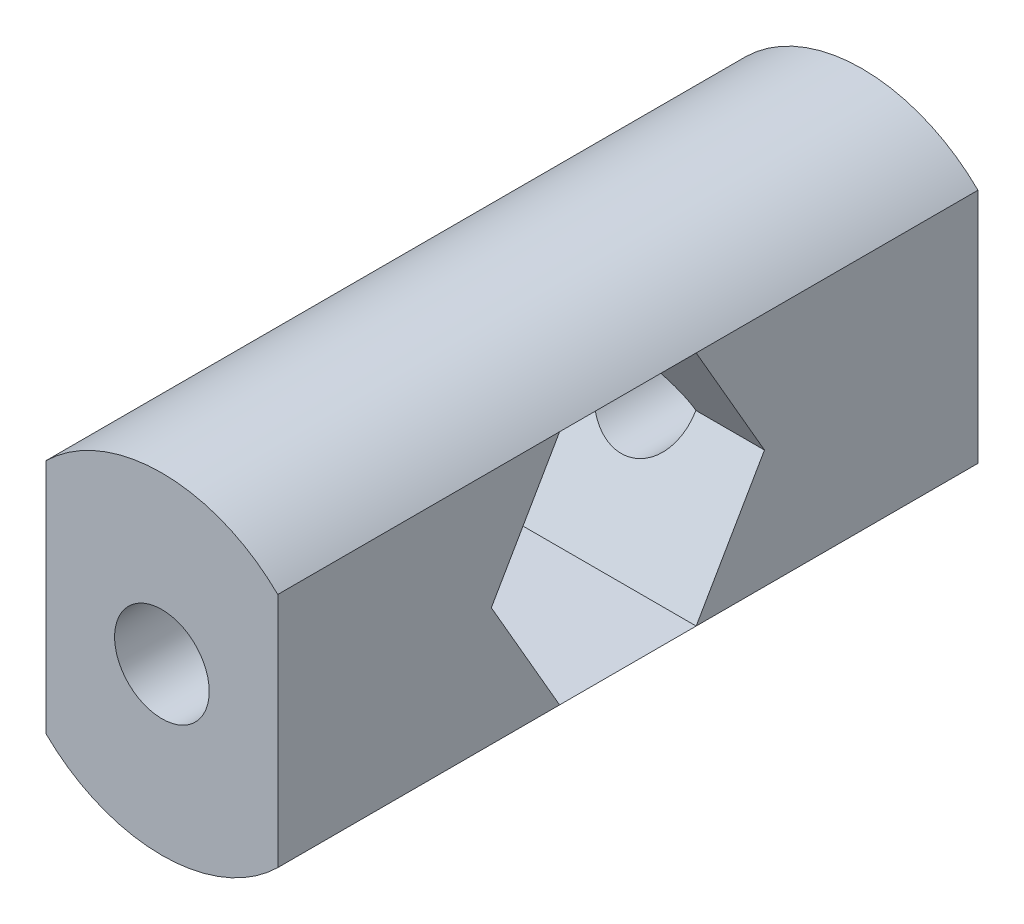
ISO-10303-21;
HEADER;
FILE_DESCRIPTION(('STEP AP214'),'2;1');
FILE_NAME('part.step','',(''),(''),'','','');
FILE_SCHEMA(('AUTOMOTIVE_DESIGN { 1 0 10303 214 1 1 1 1 }'));
ENDSEC;
DATA;
#1=APPLICATION_CONTEXT('core data for automotive mechanical design processes');
#2=APPLICATION_PROTOCOL_DEFINITION('international standard','automotive_design',2000,#1);
#3=PRODUCT_CONTEXT('',#1,'mechanical');
#4=PRODUCT('Part','Part','',(#3));
#5=PRODUCT_RELATED_PRODUCT_CATEGORY('part','',(#4));
#6=PRODUCT_DEFINITION_FORMATION('','',#4);
#7=PRODUCT_DEFINITION_CONTEXT('part definition',#1,'design');
#8=PRODUCT_DEFINITION('design','',#6,#7);
#9=PRODUCT_DEFINITION_SHAPE('','',#8);
#10=(LENGTH_UNIT() NAMED_UNIT(*) SI_UNIT(.MILLI.,.METRE.));
#11=(NAMED_UNIT(*) PLANE_ANGLE_UNIT() SI_UNIT($,.RADIAN.));
#12=(NAMED_UNIT(*) SI_UNIT($,.STERADIAN.) SOLID_ANGLE_UNIT());
#13=UNCERTAINTY_MEASURE_WITH_UNIT(LENGTH_MEASURE(1.E-05),#10,'distance_accuracy_value','');
#14=(GEOMETRIC_REPRESENTATION_CONTEXT(3) GLOBAL_UNCERTAINTY_ASSIGNED_CONTEXT((#13)) GLOBAL_UNIT_ASSIGNED_CONTEXT((#10,
#11,#12)) REPRESENTATION_CONTEXT('',''));
#15=CARTESIAN_POINT('',(0.,0.,0.));
#16=DIRECTION('',(0.,0.,1.));
#17=DIRECTION('',(1.,0.,0.));
#18=AXIS2_PLACEMENT_3D('',#15,#16,#17);
#19=CARTESIAN_POINT('',(12.2474487139159,12.5,-37.));
#20=DIRECTION('',(-1.,0.,0.));
#21=DIRECTION('',(0.,0.,1.));
#22=AXIS2_PLACEMENT_3D('',#19,#20,#21);
#23=PLANE('',#22);
#24=DIRECTION('',(0.,0.,1.));
#25=VECTOR('',#24,1.);
#26=CARTESIAN_POINT('',(12.2474487139159,-12.5,-37.));
#27=LINE('',#26,#25);
#28=CARTESIAN_POINT('',(12.2474487139159,-12.5,7.21687836487032));
#29=VERTEX_POINT('',#28);
#30=CARTESIAN_POINT('',(12.2474487139159,-12.5,37.));
#31=VERTEX_POINT('',#30);
#32=EDGE_CURVE('E165',#29,#31,#27,.T.);
#33=ORIENTED_EDGE('',*,*,#32,.F.);
#34=DIRECTION('',(0.,-0.866025403784439,-0.5));
#35=VECTOR('',#34,1.);
#36=CARTESIAN_POINT('',(12.2474487139159,0.,14.4337567297406));
#37=LINE('',#36,#35);
#38=CARTESIAN_POINT('',(12.2474487139159,0.,14.4337567297406));
#39=VERTEX_POINT('',#38);
#40=EDGE_CURVE('E253',#39,#29,#37,.T.);
#41=ORIENTED_EDGE('',*,*,#40,.F.);
#42=DIRECTION('',(0.,-0.866025403784439,0.5));
#43=VECTOR('',#42,1.);
#44=CARTESIAN_POINT('',(12.2474487139159,12.5,7.21687836487032));
#45=LINE('',#44,#43);
#46=CARTESIAN_POINT('',(12.2474487139159,12.5,7.21687836487032));
#47=VERTEX_POINT('',#46);
#48=EDGE_CURVE('E148',#47,#39,#45,.T.);
#49=ORIENTED_EDGE('',*,*,#48,.F.);
#50=DIRECTION('',(0.,0.,1.));
#51=VECTOR('',#50,1.);
#52=CARTESIAN_POINT('',(12.2474487139159,12.5,-37.));
#53=LINE('',#52,#51);
#54=CARTESIAN_POINT('',(12.2474487139159,12.5,37.));
#55=VERTEX_POINT('',#54);
#56=EDGE_CURVE('E147',#47,#55,#53,.T.);
#57=ORIENTED_EDGE('',*,*,#56,.T.);
#58=DIRECTION('',(0.,-1.,0.));
#59=VECTOR('',#58,1.);
#60=CARTESIAN_POINT('',(12.2474487139159,12.5,37.));
#61=LINE('',#60,#59);
#62=EDGE_CURVE('E161',#55,#31,#61,.T.);
#63=ORIENTED_EDGE('',*,*,#62,.T.);
#64=EDGE_LOOP('',(#33,#41,#49,#57,#63));
#65=FACE_BOUND('',#64,.T.);
#66=ADVANCED_FACE('F33',(#65),#23,.F.);
#67=CARTESIAN_POINT('',(-12.2474487139159,12.5,-37.));
#68=DIRECTION('',(1.,0.,0.));
#69=DIRECTION('',(0.,0.,-1.));
#70=AXIS2_PLACEMENT_3D('',#67,#68,#69);
#71=PLANE('',#70);
#72=DIRECTION('',(0.,-0.866025403784439,0.5));
#73=VECTOR('',#72,1.);
#74=CARTESIAN_POINT('',(-12.2474487139159,31.6464699700121,-3.83734122634725));
#75=LINE('',#74,#73);
#76=CARTESIAN_POINT('',(-12.2474487139159,12.5,7.21687836487032));
#77=VERTEX_POINT('',#76);
#78=CARTESIAN_POINT('',(-12.2474487139159,0.,14.4337567297406));
#79=VERTEX_POINT('',#78);
#80=EDGE_CURVE('E204',#77,#79,#75,.T.);
#81=ORIENTED_EDGE('',*,*,#80,.T.);
#82=DIRECTION('',(0.,-0.866025403784439,-0.5));
#83=VECTOR('',#82,1.);
#84=CARTESIAN_POINT('',(-12.2474487139159,-12.8964699700121,6.98797632095823));
#85=LINE('',#84,#83);
#86=CARTESIAN_POINT('',(-12.2474487139159,-12.5,7.21687836487032));
#87=VERTEX_POINT('',#86);
#88=EDGE_CURVE('E192',#79,#87,#85,.T.);
#89=ORIENTED_EDGE('',*,*,#88,.T.);
#90=DIRECTION('',(0.,0.,1.));
#91=VECTOR('',#90,1.);
#92=CARTESIAN_POINT('',(-12.2474487139159,-12.5,-37.));
#93=LINE('',#92,#91);
#94=CARTESIAN_POINT('',(-12.2474487139159,-12.5,37.));
#95=VERTEX_POINT('',#94);
#96=EDGE_CURVE('E227',#87,#95,#93,.T.);
#97=ORIENTED_EDGE('',*,*,#96,.T.);
#98=DIRECTION('',(0.,1.,0.));
#99=VECTOR('',#98,1.);
#100=CARTESIAN_POINT('',(-12.2474487139159,12.5,37.));
#101=LINE('',#100,#99);
#102=CARTESIAN_POINT('',(-12.2474487139159,12.5,37.));
#103=VERTEX_POINT('',#102);
#104=EDGE_CURVE('E214',#95,#103,#101,.T.);
#105=ORIENTED_EDGE('',*,*,#104,.T.);
#106=DIRECTION('',(0.,0.,1.));
#107=VECTOR('',#106,1.);
#108=CARTESIAN_POINT('',(-12.2474487139159,12.5,-37.));
#109=LINE('',#108,#107);
#110=EDGE_CURVE('E220',#77,#103,#109,.T.);
#111=ORIENTED_EDGE('',*,*,#110,.F.);
#112=EDGE_LOOP('',(#81,#89,#97,#105,#111));
#113=FACE_BOUND('',#112,.T.);
#114=ADVANCED_FACE('F245',(#113),#71,.F.);
#115=CARTESIAN_POINT('',(0.,0.,-37.));
#116=DIRECTION('',(0.,0.,1.));
#117=DIRECTION('',(1.,0.,0.));
#118=AXIS2_PLACEMENT_3D('',#115,#116,#117);
#119=CYLINDRICAL_SURFACE('',#118,5.);
#120=CARTESIAN_POINT('',(0.,0.,14.4337567297406));
#121=DIRECTION('',(0.,0.5,0.866025403784439));
#122=DIRECTION('',(0.,-0.866025403784439,0.5));
#123=AXIS2_PLACEMENT_3D('',#120,#121,#122);
#124=ELLIPSE('',#123,5.77350269189626,5.);
#125=CARTESIAN_POINT('',(-4.99999999999998,0.,14.4337567297406));
#126=VERTEX_POINT('',#125);
#127=CARTESIAN_POINT('',(5.00000000000002,0.,14.4337567297406));
#128=VERTEX_POINT('',#127);
#129=EDGE_CURVE('E41',#126,#128,#124,.F.);
#130=ORIENTED_EDGE('',*,*,#129,.T.);
#131=CARTESIAN_POINT('',(0.,0.,14.4337567297406));
#132=DIRECTION('',(0.,-0.5,0.866025403784439));
#133=DIRECTION('',(0.,0.866025403784439,0.5));
#134=AXIS2_PLACEMENT_3D('',#131,#132,#133);
#135=ELLIPSE('',#134,5.77350269189626,5.);
#136=EDGE_CURVE('E11',#128,#126,#135,.F.);
#137=ORIENTED_EDGE('',*,*,#136,.T.);
#138=EDGE_LOOP('',(#130,#137));
#139=FACE_BOUND('',#138,.T.);
#140=CARTESIAN_POINT('',(0.,0.,37.));
#141=DIRECTION('',(0.,0.,1.));
#142=DIRECTION('',(1.,0.,0.));
#143=AXIS2_PLACEMENT_3D('',#140,#141,#142);
#144=CIRCLE('',#143,5.);
#145=CARTESIAN_POINT('',(5.,0.,37.));
#146=VERTEX_POINT('',#145);
#147=EDGE_CURVE('E210',#146,#146,#144,.T.);
#148=ORIENTED_EDGE('',*,*,#147,.T.);
#149=EDGE_LOOP('',(#148));
#150=FACE_BOUND('',#149,.T.);
#151=ADVANCED_FACE('F177',(#139,#150),#119,.F.);
#152=CARTESIAN_POINT('',(0.,0.,37.));
#153=DIRECTION('',(0.,0.,-1.));
#154=DIRECTION('',(-1.,0.,0.));
#155=AXIS2_PLACEMENT_3D('',#152,#153,#154);
#156=CYLINDRICAL_SURFACE('',#155,17.5);
#157=CARTESIAN_POINT('',(0.,0.,37.));
#158=DIRECTION('',(0.,0.,1.));
#159=DIRECTION('',(1.,0.,0.));
#160=AXIS2_PLACEMENT_3D('',#157,#158,#159);
#161=CIRCLE('',#160,17.5);
#162=EDGE_CURVE('E169',#95,#31,#161,.T.);
#163=ORIENTED_EDGE('',*,*,#162,.F.);
#164=ORIENTED_EDGE('',*,*,#96,.F.);
#165=CARTESIAN_POINT('',(-12.2474487139159,-12.5,-7.21687836487032));
#166=VERTEX_POINT('',#165);
#167=EDGE_CURVE('E226',#166,#87,#93,.T.);
#168=ORIENTED_EDGE('',*,*,#167,.F.);
#169=CARTESIAN_POINT('',(-12.2474487139159,-12.5,-37.));
#170=VERTEX_POINT('',#169);
#171=EDGE_CURVE('E223',#170,#166,#93,.T.);
#172=ORIENTED_EDGE('',*,*,#171,.F.);
#173=CARTESIAN_POINT('',(0.,0.,-37.));
#174=DIRECTION('',(0.,0.,1.));
#175=DIRECTION('',(1.,0.,0.));
#176=AXIS2_PLACEMENT_3D('',#173,#174,#175);
#177=CIRCLE('',#176,17.5);
#178=CARTESIAN_POINT('',(12.2474487139159,-12.5,-37.));
#179=VERTEX_POINT('',#178);
#180=EDGE_CURVE('E154',#170,#179,#177,.T.);
#181=ORIENTED_EDGE('',*,*,#180,.T.);
#182=CARTESIAN_POINT('',(12.2474487139159,-12.5,-7.21687836487032));
#183=VERTEX_POINT('',#182);
#184=EDGE_CURVE('E158',#179,#183,#27,.T.);
#185=ORIENTED_EDGE('',*,*,#184,.T.);
#186=DIRECTION('',(0.,0.,-1.));
#187=VECTOR('',#186,1.);
#188=CARTESIAN_POINT('',(12.2474487139159,-12.5,7.21687836487032));
#189=LINE('',#188,#187);
#190=EDGE_CURVE('E201',#29,#183,#189,.T.);
#191=ORIENTED_EDGE('',*,*,#190,.F.);
#192=ORIENTED_EDGE('',*,*,#32,.T.);
#193=EDGE_LOOP('',(#163,#164,#168,#172,#181,#185,#191,#192));
#194=FACE_BOUND('',#193,.T.);
#195=ADVANCED_FACE('F248',(#194),#156,.T.);
#196=CARTESIAN_POINT('',(12.2474487139159,12.5,-37.));
#197=VERTEX_POINT('',#196);
#198=CARTESIAN_POINT('',(-12.2474487139159,12.5,-37.));
#199=VERTEX_POINT('',#198);
#200=EDGE_CURVE('E156',#197,#199,#177,.T.);
#201=ORIENTED_EDGE('',*,*,#200,.T.);
#202=CARTESIAN_POINT('',(-12.2474487139159,12.5,-7.21687836487033));
#203=VERTEX_POINT('',#202);
#204=EDGE_CURVE('E228',#199,#203,#109,.T.);
#205=ORIENTED_EDGE('',*,*,#204,.T.);
#206=EDGE_CURVE('E128',#203,#77,#109,.T.);
#207=ORIENTED_EDGE('',*,*,#206,.T.);
#208=ORIENTED_EDGE('',*,*,#110,.T.);
#209=EDGE_CURVE('E166',#55,#103,#161,.T.);
#210=ORIENTED_EDGE('',*,*,#209,.F.);
#211=ORIENTED_EDGE('',*,*,#56,.F.);
#212=DIRECTION('',(0.,0.,1.));
#213=VECTOR('',#212,1.);
#214=CARTESIAN_POINT('',(12.2474487139159,12.5,-7.21687836487032));
#215=LINE('',#214,#213);
#216=CARTESIAN_POINT('',(12.2474487139159,12.5,-7.21687836487032));
#217=VERTEX_POINT('',#216);
#218=EDGE_CURVE('E125',#217,#47,#215,.T.);
#219=ORIENTED_EDGE('',*,*,#218,.F.);
#220=EDGE_CURVE('E144',#197,#217,#53,.T.);
#221=ORIENTED_EDGE('',*,*,#220,.F.);
#222=EDGE_LOOP('',(#201,#205,#207,#208,#210,#211,#219,#221));
#223=FACE_BOUND('',#222,.T.);
#224=ADVANCED_FACE('F35',(#223),#156,.T.);
#225=CARTESIAN_POINT('',(0.,0.,37.));
#226=DIRECTION('',(0.,0.,1.));
#227=DIRECTION('',(1.,0.,0.));
#228=AXIS2_PLACEMENT_3D('',#225,#226,#227);
#229=PLANE('',#228);
#230=ORIENTED_EDGE('',*,*,#147,.F.);
#231=EDGE_LOOP('',(#230));
#232=FACE_BOUND('',#231,.T.);
#233=ORIENTED_EDGE('',*,*,#104,.F.);
#234=ORIENTED_EDGE('',*,*,#162,.T.);
#235=ORIENTED_EDGE('',*,*,#62,.F.);
#236=ORIENTED_EDGE('',*,*,#209,.T.);
#237=EDGE_LOOP('',(#233,#234,#235,#236));
#238=FACE_BOUND('',#237,.T.);
#239=ADVANCED_FACE('F241',(#232,#238),#229,.T.);
#240=CARTESIAN_POINT('',(0.,0.,-37.));
#241=DIRECTION('',(0.,0.,1.));
#242=DIRECTION('',(1.,0.,0.));
#243=AXIS2_PLACEMENT_3D('',#240,#241,#242);
#244=PLANE('',#243);
#245=CARTESIAN_POINT('',(0.,0.,-37.));
#246=DIRECTION('',(0.,0.,1.));
#247=DIRECTION('',(1.,0.,0.));
#248=AXIS2_PLACEMENT_3D('',#245,#246,#247);
#249=CIRCLE('',#248,5.);
#250=CARTESIAN_POINT('',(5.,0.,-37.));
#251=VERTEX_POINT('',#250);
#252=EDGE_CURVE('E211',#251,#251,#249,.T.);
#253=ORIENTED_EDGE('',*,*,#252,.T.);
#254=EDGE_LOOP('',(#253));
#255=FACE_BOUND('',#254,.T.);
#256=ORIENTED_EDGE('',*,*,#180,.F.);
#257=DIRECTION('',(0.,1.,0.));
#258=VECTOR('',#257,1.);
#259=CARTESIAN_POINT('',(-12.2474487139159,12.5,-37.));
#260=LINE('',#259,#258);
#261=EDGE_CURVE('E217',#170,#199,#260,.T.);
#262=ORIENTED_EDGE('',*,*,#261,.T.);
#263=ORIENTED_EDGE('',*,*,#200,.F.);
#264=DIRECTION('',(0.,-1.,0.));
#265=VECTOR('',#264,1.);
#266=CARTESIAN_POINT('',(12.2474487139159,12.5,-37.));
#267=LINE('',#266,#265);
#268=EDGE_CURVE('E153',#197,#179,#267,.T.);
#269=ORIENTED_EDGE('',*,*,#268,.T.);
#270=EDGE_LOOP('',(#256,#262,#263,#269));
#271=FACE_BOUND('',#270,.T.);
#272=ADVANCED_FACE('F264',(#255,#271),#244,.F.);
#273=DIRECTION('',(0.,0.866025403784438,0.5));
#274=VECTOR('',#273,1.);
#275=CARTESIAN_POINT('',(12.2474487139159,0.,-14.4337567297406));
#276=LINE('',#275,#274);
#277=CARTESIAN_POINT('',(12.2474487139159,0.,-14.4337567297406));
#278=VERTEX_POINT('',#277);
#279=EDGE_CURVE('E134',#278,#217,#276,.T.);
#280=ORIENTED_EDGE('',*,*,#279,.F.);
#281=DIRECTION('',(0.,0.866025403784439,-0.5));
#282=VECTOR('',#281,1.);
#283=CARTESIAN_POINT('',(12.2474487139159,-12.5,-7.21687836487032));
#284=LINE('',#283,#282);
#285=EDGE_CURVE('E48',#183,#278,#284,.T.);
#286=ORIENTED_EDGE('',*,*,#285,.F.);
#287=ORIENTED_EDGE('',*,*,#184,.F.);
#288=ORIENTED_EDGE('',*,*,#268,.F.);
#289=ORIENTED_EDGE('',*,*,#220,.T.);
#290=EDGE_LOOP('',(#280,#286,#287,#288,#289));
#291=FACE_BOUND('',#290,.T.);
#292=ADVANCED_FACE('F150',(#291),#23,.F.);
#293=ORIENTED_EDGE('',*,*,#171,.T.);
#294=DIRECTION('',(0.,0.866025403784439,-0.5));
#295=VECTOR('',#294,1.);
#296=CARTESIAN_POINT('',(-12.2474487139159,19.1464699700121,-25.4879763209582));
#297=LINE('',#296,#295);
#298=CARTESIAN_POINT('',(-12.2474487139159,0.,-14.4337567297406));
#299=VERTEX_POINT('',#298);
#300=EDGE_CURVE('E207',#166,#299,#297,.T.);
#301=ORIENTED_EDGE('',*,*,#300,.T.);
#302=DIRECTION('',(0.,0.866025403784439,0.5));
#303=VECTOR('',#302,1.);
#304=CARTESIAN_POINT('',(-12.2474487139159,-0.396469970012121,-14.6626587736527));
#305=LINE('',#304,#303);
#306=EDGE_CURVE('E202',#299,#203,#305,.T.);
#307=ORIENTED_EDGE('',*,*,#306,.T.);
#308=ORIENTED_EDGE('',*,*,#204,.F.);
#309=ORIENTED_EDGE('',*,*,#261,.F.);
#310=EDGE_LOOP('',(#293,#301,#307,#308,#309));
#311=FACE_BOUND('',#310,.T.);
#312=ADVANCED_FACE('F263',(#311),#71,.F.);
#313=CARTESIAN_POINT('',(0.,0.,-14.4337567297406));
#314=DIRECTION('',(0.,0.5,-0.866025403784438));
#315=DIRECTION('',(0.,0.866025403784439,0.5));
#316=AXIS2_PLACEMENT_3D('',#313,#314,#315);
#317=ELLIPSE('',#316,5.77350269189626,5.);
#318=CARTESIAN_POINT('',(4.99999999999998,0.,-14.4337567297406));
#319=VERTEX_POINT('',#318);
#320=CARTESIAN_POINT('',(-5.00000000000002,0.,-14.4337567297406));
#321=VERTEX_POINT('',#320);
#322=EDGE_CURVE('E168',#319,#321,#317,.F.);
#323=ORIENTED_EDGE('',*,*,#322,.T.);
#324=CARTESIAN_POINT('',(0.,0.,-14.4337567297406));
#325=DIRECTION('',(0.,-0.5,-0.866025403784439));
#326=DIRECTION('',(0.,-0.866025403784439,0.5));
#327=AXIS2_PLACEMENT_3D('',#324,#325,#326);
#328=ELLIPSE('',#327,5.77350269189626,5.);
#329=EDGE_CURVE('E173',#321,#319,#328,.F.);
#330=ORIENTED_EDGE('',*,*,#329,.T.);
#331=EDGE_LOOP('',(#323,#330));
#332=FACE_BOUND('',#331,.T.);
#333=ORIENTED_EDGE('',*,*,#252,.F.);
#334=EDGE_LOOP('',(#333));
#335=FACE_BOUND('',#334,.T.);
#336=ADVANCED_FACE('F282',(#332,#335),#119,.F.);
#337=CARTESIAN_POINT('',(-61.7525512860841,-12.5,7.21687836487032));
#338=DIRECTION('',(0.,-1.,0.));
#339=DIRECTION('',(0.,0.,-1.));
#340=AXIS2_PLACEMENT_3D('',#337,#338,#339);
#341=PLANE('',#340);
#342=DIRECTION('',(1.,0.,0.));
#343=VECTOR('',#342,1.);
#344=CARTESIAN_POINT('',(-61.7525512860841,-12.5,7.21687836487032));
#345=LINE('',#344,#343);
#346=EDGE_CURVE('E193',#87,#29,#345,.T.);
#347=ORIENTED_EDGE('',*,*,#346,.T.);
#348=ORIENTED_EDGE('',*,*,#190,.T.);
#349=DIRECTION('',(1.,0.,0.));
#350=VECTOR('',#349,1.);
#351=CARTESIAN_POINT('',(-61.7525512860841,-12.5,-7.21687836487032));
#352=LINE('',#351,#350);
#353=EDGE_CURVE('E195',#166,#183,#352,.T.);
#354=ORIENTED_EDGE('',*,*,#353,.F.);
#355=ORIENTED_EDGE('',*,*,#167,.T.);
#356=EDGE_LOOP('',(#347,#348,#354,#355));
#357=FACE_BOUND('',#356,.T.);
#358=ADVANCED_FACE('F260',(#357),#341,.F.);
#359=CARTESIAN_POINT('',(-61.7525512860841,12.5,-7.21687836487032));
#360=DIRECTION('',(0.,1.,0.));
#361=DIRECTION('',(0.,0.,1.));
#362=AXIS2_PLACEMENT_3D('',#359,#360,#361);
#363=PLANE('',#362);
#364=DIRECTION('',(1.,0.,0.));
#365=VECTOR('',#364,1.);
#366=CARTESIAN_POINT('',(-61.7525512860841,12.5,-7.21687836487032));
#367=LINE('',#366,#365);
#368=EDGE_CURVE('E56',#203,#217,#367,.T.);
#369=ORIENTED_EDGE('',*,*,#368,.T.);
#370=ORIENTED_EDGE('',*,*,#218,.T.);
#371=DIRECTION('',(1.,0.,0.));
#372=VECTOR('',#371,1.);
#373=CARTESIAN_POINT('',(-61.7525512860841,12.5,7.21687836487032));
#374=LINE('',#373,#372);
#375=EDGE_CURVE('E130',#77,#47,#374,.T.);
#376=ORIENTED_EDGE('',*,*,#375,.F.);
#377=ORIENTED_EDGE('',*,*,#206,.F.);
#378=EDGE_LOOP('',(#369,#370,#376,#377));
#379=FACE_BOUND('',#378,.T.);
#380=ADVANCED_FACE('F122',(#379),#363,.F.);
#381=CARTESIAN_POINT('',(-61.7525512860841,-12.5,-7.21687836487032));
#382=DIRECTION('',(0.,-0.5,-0.866025403784439));
#383=DIRECTION('',(0.,0.866025403784439,-0.5));
#384=AXIS2_PLACEMENT_3D('',#381,#382,#383);
#385=PLANE('',#384);
#386=ORIENTED_EDGE('',*,*,#353,.T.);
#387=ORIENTED_EDGE('',*,*,#285,.T.);
#388=DIRECTION('',(1.,0.,0.));
#389=VECTOR('',#388,1.);
#390=CARTESIAN_POINT('',(-61.7525512860841,0.,-14.4337567297406));
#391=LINE('',#390,#389);
#392=EDGE_CURVE('E136',#319,#278,#391,.T.);
#393=ORIENTED_EDGE('',*,*,#392,.F.);
#394=ORIENTED_EDGE('',*,*,#329,.F.);
#395=EDGE_CURVE('E131',#299,#321,#391,.T.);
#396=ORIENTED_EDGE('',*,*,#395,.F.);
#397=ORIENTED_EDGE('',*,*,#300,.F.);
#398=EDGE_LOOP('',(#386,#387,#393,#394,#396,#397));
#399=FACE_BOUND('',#398,.T.);
#400=ADVANCED_FACE('F258',(#399),#385,.F.);
#401=CARTESIAN_POINT('',(-61.7525512860841,0.,14.4337567297406));
#402=DIRECTION('',(0.,-0.5,0.866025403784439));
#403=DIRECTION('',(0.,-0.866025403784439,-0.5));
#404=AXIS2_PLACEMENT_3D('',#401,#402,#403);
#405=PLANE('',#404);
#406=DIRECTION('',(1.,0.,0.));
#407=VECTOR('',#406,1.);
#408=CARTESIAN_POINT('',(-61.7525512860841,0.,14.4337567297406));
#409=LINE('',#408,#407);
#410=EDGE_CURVE('E184',#79,#126,#409,.T.);
#411=ORIENTED_EDGE('',*,*,#410,.T.);
#412=ORIENTED_EDGE('',*,*,#136,.F.);
#413=EDGE_CURVE('E187',#128,#39,#409,.T.);
#414=ORIENTED_EDGE('',*,*,#413,.T.);
#415=ORIENTED_EDGE('',*,*,#40,.T.);
#416=ORIENTED_EDGE('',*,*,#346,.F.);
#417=ORIENTED_EDGE('',*,*,#88,.F.);
#418=EDGE_LOOP('',(#411,#412,#414,#415,#416,#417));
#419=FACE_BOUND('',#418,.T.);
#420=ADVANCED_FACE('F189',(#419),#405,.F.);
#421=CARTESIAN_POINT('',(-61.7525512860841,12.5,7.21687836487032));
#422=DIRECTION('',(0.,0.5,0.866025403784439));
#423=DIRECTION('',(0.,-0.866025403784439,0.5));
#424=AXIS2_PLACEMENT_3D('',#421,#422,#423);
#425=PLANE('',#424);
#426=ORIENTED_EDGE('',*,*,#375,.T.);
#427=ORIENTED_EDGE('',*,*,#48,.T.);
#428=ORIENTED_EDGE('',*,*,#413,.F.);
#429=ORIENTED_EDGE('',*,*,#129,.F.);
#430=ORIENTED_EDGE('',*,*,#410,.F.);
#431=ORIENTED_EDGE('',*,*,#80,.F.);
#432=EDGE_LOOP('',(#426,#427,#428,#429,#430,#431));
#433=FACE_BOUND('',#432,.T.);
#434=ADVANCED_FACE('F183',(#433),#425,.F.);
#435=CARTESIAN_POINT('',(-61.7525512860841,0.,-14.4337567297406));
#436=DIRECTION('',(0.,0.5,-0.866025403784438));
#437=DIRECTION('',(0.,0.866025403784439,0.5));
#438=AXIS2_PLACEMENT_3D('',#435,#436,#437);
#439=PLANE('',#438);
#440=ORIENTED_EDGE('',*,*,#395,.T.);
#441=ORIENTED_EDGE('',*,*,#322,.F.);
#442=ORIENTED_EDGE('',*,*,#392,.T.);
#443=ORIENTED_EDGE('',*,*,#279,.T.);
#444=ORIENTED_EDGE('',*,*,#368,.F.);
#445=ORIENTED_EDGE('',*,*,#306,.F.);
#446=EDGE_LOOP('',(#440,#441,#442,#443,#444,#445));
#447=FACE_BOUND('',#446,.T.);
#448=ADVANCED_FACE('F135',(#447),#439,.F.);
#449=CLOSED_SHELL('',(#66,#114,#151,#195,#224,#239,#272,#292,#312,#336,#358,#380,#400,#420,#434,#448));
#450=MANIFOLD_SOLID_BREP('B2',#449);
#451=ADVANCED_BREP_SHAPE_REPRESENTATION('',(#18,#450),#14);
#452=SHAPE_DEFINITION_REPRESENTATION(#9,#451);
ENDSEC;
END-ISO-10303-21;
